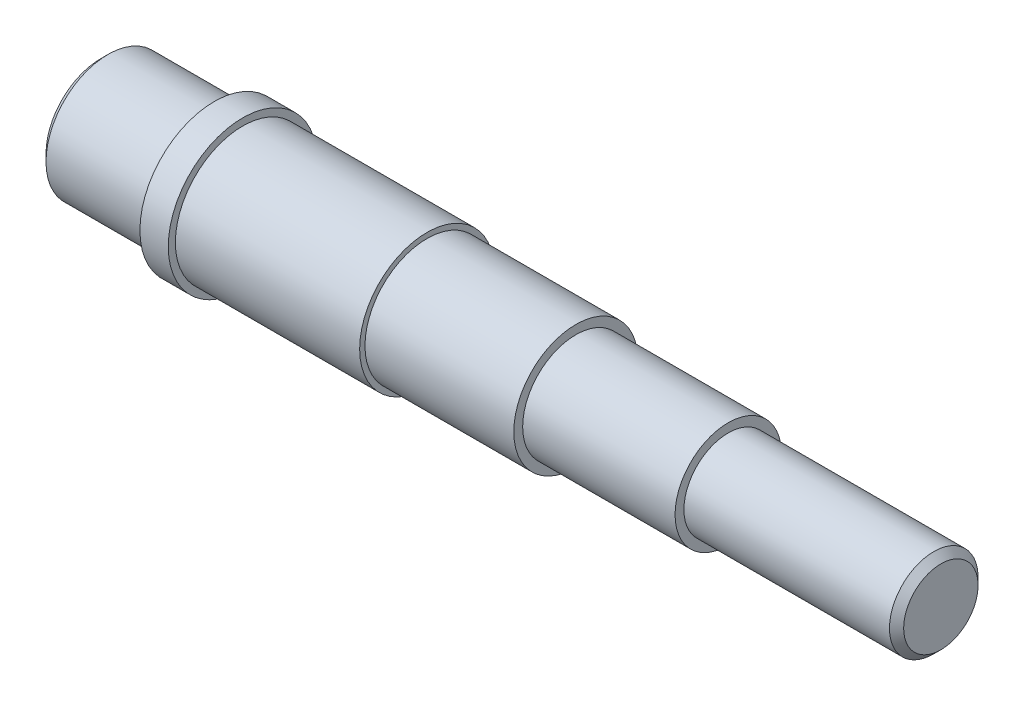
ISO-10303-21;
HEADER;
FILE_DESCRIPTION(('STEP AP214'),'2;1');
FILE_NAME('part.step','',(''),(''),'','','');
FILE_SCHEMA(('AUTOMOTIVE_DESIGN { 1 0 10303 214 1 1 1 1 }'));
ENDSEC;
DATA;
#1=APPLICATION_CONTEXT('core data for automotive mechanical design processes');
#2=APPLICATION_PROTOCOL_DEFINITION('international standard','automotive_design',2000,#1);
#3=PRODUCT_CONTEXT('',#1,'mechanical');
#4=PRODUCT('Part','Part','',(#3));
#5=PRODUCT_RELATED_PRODUCT_CATEGORY('part','',(#4));
#6=PRODUCT_DEFINITION_FORMATION('','',#4);
#7=PRODUCT_DEFINITION_CONTEXT('part definition',#1,'design');
#8=PRODUCT_DEFINITION('design','',#6,#7);
#9=PRODUCT_DEFINITION_SHAPE('','',#8);
#10=(LENGTH_UNIT() NAMED_UNIT(*) SI_UNIT(.MILLI.,.METRE.));
#11=(NAMED_UNIT(*) PLANE_ANGLE_UNIT() SI_UNIT($,.RADIAN.));
#12=(NAMED_UNIT(*) SI_UNIT($,.STERADIAN.) SOLID_ANGLE_UNIT());
#13=UNCERTAINTY_MEASURE_WITH_UNIT(LENGTH_MEASURE(1.E-05),#10,'distance_accuracy_value','');
#14=(GEOMETRIC_REPRESENTATION_CONTEXT(3) GLOBAL_UNCERTAINTY_ASSIGNED_CONTEXT((#13)) GLOBAL_UNIT_ASSIGNED_CONTEXT((#10,
#11,#12)) REPRESENTATION_CONTEXT('',''));
#15=CARTESIAN_POINT('',(0.,0.,0.));
#16=DIRECTION('',(0.,0.,1.));
#17=DIRECTION('',(1.,0.,0.));
#18=AXIS2_PLACEMENT_3D('',#15,#16,#17);
#19=CARTESIAN_POINT('',(-128.123292872515,0.,0.));
#20=DIRECTION('',(1.,0.,0.));
#21=DIRECTION('',(0.,0.,-1.));
#22=AXIS2_PLACEMENT_3D('',#19,#20,#21);
#23=PLANE('',#22);
#24=CARTESIAN_POINT('',(-128.123292872515,0.,0.));
#25=DIRECTION('',(-1.,0.,0.));
#26=DIRECTION('',(0.,0.,1.));
#27=AXIS2_PLACEMENT_3D('',#24,#25,#26);
#28=CIRCLE('',#27,15.5);
#29=CARTESIAN_POINT('',(-128.123292872515,0.,15.5));
#30=VERTEX_POINT('',#29);
#31=EDGE_CURVE('E191',#30,#30,#28,.T.);
#32=ORIENTED_EDGE('',*,*,#31,.T.);
#33=EDGE_LOOP('',(#32));
#34=FACE_BOUND('',#33,.T.);
#35=ADVANCED_FACE('F34',(#34),#23,.F.);
#36=CARTESIAN_POINT('',(-126.123292872515,0.,0.));
#37=DIRECTION('',(1.,0.,0.));
#38=DIRECTION('',(0.,0.,-1.));
#39=AXIS2_PLACEMENT_3D('',#36,#37,#38);
#40=CONICAL_SURFACE('',#39,17.5,0.785398163397448);
#41=ORIENTED_EDGE('',*,*,#31,.F.);
#42=EDGE_LOOP('',(#41));
#43=FACE_BOUND('',#42,.T.);
#44=CARTESIAN_POINT('',(-126.123292872515,0.,0.));
#45=DIRECTION('',(-1.,0.,0.));
#46=DIRECTION('',(0.,0.,1.));
#47=AXIS2_PLACEMENT_3D('',#44,#45,#46);
#48=CIRCLE('',#47,17.5);
#49=CARTESIAN_POINT('',(-126.123292872515,0.,17.5));
#50=VERTEX_POINT('',#49);
#51=EDGE_CURVE('E188',#50,#50,#48,.T.);
#52=ORIENTED_EDGE('',*,*,#51,.T.);
#53=EDGE_LOOP('',(#52));
#54=FACE_BOUND('',#53,.T.);
#55=ADVANCED_FACE('F243',(#43,#54),#40,.T.);
#56=CARTESIAN_POINT('',(-128.123292872515,0.,0.));
#57=DIRECTION('',(-1.,0.,0.));
#58=DIRECTION('',(0.,0.,1.));
#59=AXIS2_PLACEMENT_3D('',#56,#57,#58);
#60=CYLINDRICAL_SURFACE('',#59,17.5);
#61=ORIENTED_EDGE('',*,*,#51,.F.);
#62=EDGE_LOOP('',(#61));
#63=FACE_BOUND('',#62,.T.);
#64=CARTESIAN_POINT('',(-96.1232928725146,0.,0.));
#65=DIRECTION('',(-1.,0.,0.));
#66=DIRECTION('',(0.,0.,1.));
#67=AXIS2_PLACEMENT_3D('',#64,#65,#66);
#68=CIRCLE('',#67,17.5);
#69=CARTESIAN_POINT('',(-96.1232928725146,0.,17.5));
#70=VERTEX_POINT('',#69);
#71=EDGE_CURVE('E185',#70,#70,#68,.T.);
#72=ORIENTED_EDGE('',*,*,#71,.T.);
#73=EDGE_LOOP('',(#72));
#74=FACE_BOUND('',#73,.T.);
#75=ADVANCED_FACE('F248',(#63,#74),#60,.T.);
#76=CARTESIAN_POINT('',(-96.1232928725146,0.,-17.5));
#77=DIRECTION('',(1.,0.,0.));
#78=DIRECTION('',(0.,0.,-1.));
#79=AXIS2_PLACEMENT_3D('',#76,#77,#78);
#80=PLANE('',#79);
#81=ORIENTED_EDGE('',*,*,#71,.F.);
#82=EDGE_LOOP('',(#81));
#83=FACE_BOUND('',#82,.T.);
#84=CARTESIAN_POINT('',(-96.1232928725146,0.,0.));
#85=DIRECTION('',(-1.,0.,0.));
#86=DIRECTION('',(0.,0.,1.));
#87=AXIS2_PLACEMENT_3D('',#84,#85,#86);
#88=CIRCLE('',#87,21.);
#89=CARTESIAN_POINT('',(-96.1232928725146,0.,21.));
#90=VERTEX_POINT('',#89);
#91=EDGE_CURVE('E182',#90,#90,#88,.T.);
#92=ORIENTED_EDGE('',*,*,#91,.T.);
#93=EDGE_LOOP('',(#92));
#94=FACE_BOUND('',#93,.T.);
#95=ADVANCED_FACE('F256',(#83,#94),#80,.F.);
#96=CARTESIAN_POINT('',(-128.123292872515,0.,0.));
#97=DIRECTION('',(-1.,0.,0.));
#98=DIRECTION('',(0.,0.,1.));
#99=AXIS2_PLACEMENT_3D('',#96,#97,#98);
#100=CYLINDRICAL_SURFACE('',#99,21.);
#101=ORIENTED_EDGE('',*,*,#91,.F.);
#102=EDGE_LOOP('',(#101));
#103=FACE_BOUND('',#102,.T.);
#104=CARTESIAN_POINT('',(-88.1232928725146,0.,0.));
#105=DIRECTION('',(-1.,0.,0.));
#106=DIRECTION('',(0.,0.,1.));
#107=AXIS2_PLACEMENT_3D('',#104,#105,#106);
#108=CIRCLE('',#107,21.);
#109=CARTESIAN_POINT('',(-88.1232928725146,0.,21.));
#110=VERTEX_POINT('',#109);
#111=EDGE_CURVE('E179',#110,#110,#108,.T.);
#112=ORIENTED_EDGE('',*,*,#111,.T.);
#113=EDGE_LOOP('',(#112));
#114=FACE_BOUND('',#113,.T.);
#115=ADVANCED_FACE('F262',(#103,#114),#100,.T.);
#116=CARTESIAN_POINT('',(-88.1232928725146,0.,-21.));
#117=DIRECTION('',(-1.,0.,0.));
#118=DIRECTION('',(0.,0.,1.));
#119=AXIS2_PLACEMENT_3D('',#116,#117,#118);
#120=PLANE('',#119);
#121=ORIENTED_EDGE('',*,*,#111,.F.);
#122=EDGE_LOOP('',(#121));
#123=FACE_BOUND('',#122,.T.);
#124=CARTESIAN_POINT('',(-88.1232928725146,0.,0.));
#125=DIRECTION('',(-1.,0.,0.));
#126=DIRECTION('',(0.,0.,1.));
#127=AXIS2_PLACEMENT_3D('',#124,#125,#126);
#128=CIRCLE('',#127,19.);
#129=CARTESIAN_POINT('',(-88.1232928725146,0.,19.));
#130=VERTEX_POINT('',#129);
#131=EDGE_CURVE('E176',#130,#130,#128,.T.);
#132=ORIENTED_EDGE('',*,*,#131,.T.);
#133=EDGE_LOOP('',(#132));
#134=FACE_BOUND('',#133,.T.);
#135=ADVANCED_FACE('F268',(#123,#134),#120,.F.);
#136=CARTESIAN_POINT('',(-128.123292872515,0.,0.));
#137=DIRECTION('',(-1.,0.,0.));
#138=DIRECTION('',(0.,0.,1.));
#139=AXIS2_PLACEMENT_3D('',#136,#137,#138);
#140=CYLINDRICAL_SURFACE('',#139,19.);
#141=DIRECTION('',(-1.,0.,0.));
#142=VECTOR('',#141,1.);
#143=CARTESIAN_POINT('',(-128.123292872515,-5.00000000000001,-18.3303027798234));
#144=LINE('',#143,#142);
#145=CARTESIAN_POINT('',(-79.1232928725146,-5.,-18.3303027798234));
#146=VERTEX_POINT('',#145);
#147=CARTESIAN_POINT('',(-44.1232928725146,-5.,-18.3303027798234));
#148=VERTEX_POINT('',#147);
#149=EDGE_CURVE('E11',#146,#148,#144,.F.);
#150=ORIENTED_EDGE('',*,*,#149,.T.);
#151=CARTESIAN_POINT('',(-44.1232928725146,-5.,-18.3303027798234));
#152=CARTESIAN_POINT('',(-43.9852766753139,-5.00001766668261,-18.3302859082857));
#153=CARTESIAN_POINT('',(-43.8472666764302,-4.99428620669549,-18.3318609913296));
#154=CARTESIAN_POINT('',(-43.5722838189438,-4.97145574831054,-18.3380720236008));
#155=CARTESIAN_POINT('',(-43.4353107762324,-4.95435881807958,-18.3427074159445));
#156=CARTESIAN_POINT('',(-43.1636627714728,-4.90897601752026,-18.3549032155987));
#157=CARTESIAN_POINT('',(-43.0289835671527,-4.88071385252822,-18.3624574251155));
#158=CARTESIAN_POINT('',(-42.7625790742533,-4.8132462031306,-18.3802580223183));
#159=CARTESIAN_POINT('',(-42.6308538351485,-4.77404053558503,-18.3905044550585));
#160=CARTESIAN_POINT('',(-42.3713046512391,-4.68501289335864,-18.4133853968542));
#161=CARTESIAN_POINT('',(-42.243479240553,-4.63519496528776,-18.4260189954416));
#162=CARTESIAN_POINT('',(-41.9925125113837,-4.52532553542389,-18.4533094170246));
#163=CARTESIAN_POINT('',(-41.8693729522717,-4.46527023534238,-18.4679669905744));
#164=CARTESIAN_POINT('',(-41.508228444171,-4.27037749337001,-18.5143659713688));
#165=CARTESIAN_POINT('',(-41.2783055316541,-4.12074697519632,-18.5485515146361));
#166=CARTESIAN_POINT('',(-40.8416034995497,-3.78266195018417,-18.6204696894086));
#167=CARTESIAN_POINT('',(-40.6354396606521,-3.59343075278062,-18.658263492612));
#168=CARTESIAN_POINT('',(-40.2573304275002,-3.18310193538117,-18.732625835079));
#169=CARTESIAN_POINT('',(-40.0853905689688,-2.96199917012089,-18.76919417533));
#170=CARTESIAN_POINT('',(-39.7781134581538,-2.48996924780924,-18.8376675811324));
#171=CARTESIAN_POINT('',(-39.6433875832447,-2.23863143936237,-18.8694912031433));
#172=CARTESIAN_POINT('',(-39.4183393902255,-1.71590637997247,-18.9241806310349));
#173=CARTESIAN_POINT('',(-39.3280076729719,-1.44452338700979,-18.9470483328572));
#174=CARTESIAN_POINT('',(-39.1962957803549,-0.895832897884245,-18.9808144065777));
#175=CARTESIAN_POINT('',(-39.1538677288869,-0.618792947063998,-18.9919686097243));
#176=CARTESIAN_POINT('',(-39.1158719037671,-0.0613112052362413,-19.0019448285789));
#177=CARTESIAN_POINT('',(-39.120297506908,0.219130099359589,-19.0007685873121));
#178=CARTESIAN_POINT('',(-39.1751415050027,0.768151117298731,-18.9864044979906));
#179=CARTESIAN_POINT('',(-39.2244270669913,1.03685296683871,-18.9735125161181));
#180=CARTESIAN_POINT('',(-39.3657726178937,1.562032997849,-18.9375121568335));
#181=CARTESIAN_POINT('',(-39.4578346076658,1.81851060691425,-18.9144033015318));
#182=CARTESIAN_POINT('',(-39.6829640504233,2.3148475496931,-18.8601298911963));
#183=CARTESIAN_POINT('',(-39.816423112912,2.55452016615559,-18.8288888816724));
#184=CARTESIAN_POINT('',(-40.1203895872577,3.00854301144998,-18.7616994100197));
#185=CARTESIAN_POINT('',(-40.2909032872355,3.22288893283458,-18.7257501493189));
#186=CARTESIAN_POINT('',(-40.5736655411899,3.52419659305494,-18.6705907034911));
#187=CARTESIAN_POINT('',(-40.6741116249612,3.62255621938199,-18.6517101060183));
#188=CARTESIAN_POINT('',(-40.882942248198,3.81048914275925,-18.6142238908637));
#189=CARTESIAN_POINT('',(-40.9913239939339,3.90006550620351,-18.5956181791551));
#190=CARTESIAN_POINT('',(-41.2153993863113,4.0698819613128,-18.5591922415691));
#191=CARTESIAN_POINT('',(-41.331097817823,4.15011584380694,-18.5413725429207));
#192=CARTESIAN_POINT('',(-41.5689449540047,4.3005928981472,-18.5070487697456));
#193=CARTESIAN_POINT('',(-41.6910911361465,4.37083993796059,-18.4905441869608));
#194=CARTESIAN_POINT('',(-41.9419150946349,4.50130100976656,-18.4592205654969));
#195=CARTESIAN_POINT('',(-42.0706318161017,4.56144316630361,-18.4444138217068));
#196=CARTESIAN_POINT('',(-42.3328733538445,4.67060599397032,-18.4170737812662));
#197=CARTESIAN_POINT('',(-42.4663962142551,4.71963113120057,-18.4045395720651));
#198=CARTESIAN_POINT('',(-42.7371961708602,4.80613348025077,-18.3821401987773));
#199=CARTESIAN_POINT('',(-42.8744692113669,4.84362266837273,-18.3722722679413));
#200=CARTESIAN_POINT('',(-43.1518289985406,4.90677851660471,-18.3555057309761));
#201=CARTESIAN_POINT('',(-43.2919144004819,4.93245069281332,-18.3486057395322));
#202=CARTESIAN_POINT('',(-43.5472608799676,4.96805016310397,-18.3389956133326));
#203=CARTESIAN_POINT('',(-43.662219297974,4.98003415018343,-18.3357406080542));
#204=CARTESIAN_POINT('',(-43.8925463017877,4.99600639007608,-18.3313920220704));
#205=CARTESIAN_POINT('',(-44.0079139416976,5.00000735763537,-18.3302950043258));
#206=CARTESIAN_POINT('',(-44.1232928725146,5.,-18.3303027798234));
#207=B_SPLINE_CURVE_WITH_KNOTS('',3,(#151,#152,#153,#154,#155,#156,#157,#158,#159,#160,#161,
#162,#163,#164,#165,#166,#167,#168,#169,#170,#171,#172,#173,#174,#175,#176,#177,#178,#179,#180,
#181,#182,#183,#184,#185,#186,#187,#188,#189,#190,#191,#192,#193,#194,#195,#196,#197,#198,#199,
#200,#201,#202,#203,#204,#205,#206),.UNSPECIFIED.,.F.,.F.,(4,2,2,2,2,2,2,2,2,2,2,2,2,2,2,2,2,2,
2,2,2,2,2,2,2,2,2,4),(0.,0.413911055875706,0.827746813248339,1.24070862177835,1.65367734165684,
2.06648887151102,2.47945389814995,3.30477934860257,4.14813364543846,4.99162424403129,
5.84824381544335,6.70468194490246,7.54199904887895,8.37919779174081,9.19582441640862,
10.0124892424595,10.8371281703848,11.6619071478275,12.0870382665453,12.5120204319564,
12.9372834547274,13.3623813190941,13.7903854272744,14.2182172852097,14.6456034696819,
15.0727899504498,15.4193832237595,15.7654240276075),.UNSPECIFIED.);
#208=CARTESIAN_POINT('',(-44.1232928725146,5.,-18.3303027798234));
#209=VERTEX_POINT('',#208);
#210=EDGE_CURVE('E318',#148,#209,#207,.T.);
#211=ORIENTED_EDGE('',*,*,#210,.T.);
#212=DIRECTION('',(-1.,0.,0.));
#213=VECTOR('',#212,1.);
#214=CARTESIAN_POINT('',(-128.123292872515,5.,-18.3303027798234));
#215=LINE('',#214,#213);
#216=CARTESIAN_POINT('',(-79.1232928725146,5.,-18.3303027798234));
#217=VERTEX_POINT('',#216);
#218=EDGE_CURVE('E41',#209,#217,#215,.T.);
#219=ORIENTED_EDGE('',*,*,#218,.T.);
#220=CARTESIAN_POINT('',(-79.1232928725146,5.,-18.3303027798234));
#221=CARTESIAN_POINT('',(-79.2613090697152,5.00001766668261,-18.3302859082857));
#222=CARTESIAN_POINT('',(-79.3993190685989,4.9942862066955,-18.3318609913296));
#223=CARTESIAN_POINT('',(-79.6743019260853,4.97145574831055,-18.3380720236008));
#224=CARTESIAN_POINT('',(-79.8112749687967,4.95435881807958,-18.3427074159445));
#225=CARTESIAN_POINT('',(-80.0829229735564,4.90897601752026,-18.3549032155987));
#226=CARTESIAN_POINT('',(-80.2176021778764,4.88071385252822,-18.3624574251155));
#227=CARTESIAN_POINT('',(-80.4840066707758,4.81324620313061,-18.3802580223183));
#228=CARTESIAN_POINT('',(-80.6157319098806,4.77404053558504,-18.3905044550585));
#229=CARTESIAN_POINT('',(-80.8752810937901,4.68501289335865,-18.4133853968542));
#230=CARTESIAN_POINT('',(-81.0031065044761,4.63519496528777,-18.4260189954416));
#231=CARTESIAN_POINT('',(-81.2540732336454,4.5253255354239,-18.4533094170246));
#232=CARTESIAN_POINT('',(-81.3772127927574,4.46527023534239,-18.4679669905744));
#233=CARTESIAN_POINT('',(-81.7383573008581,4.27037749337003,-18.5143659713688));
#234=CARTESIAN_POINT('',(-81.9682802133751,4.12074697519632,-18.5485515146361));
#235=CARTESIAN_POINT('',(-82.4049822454794,3.78266195018417,-18.6204696894086));
#236=CARTESIAN_POINT('',(-82.611146084377,3.59343075278063,-18.658263492612));
#237=CARTESIAN_POINT('',(-82.9892553175289,3.18310193538118,-18.732625835079));
#238=CARTESIAN_POINT('',(-83.1611951760604,2.9619991701209,-18.76919417533));
#239=CARTESIAN_POINT('',(-83.4684722868753,2.48996924780925,-18.8376675811324));
#240=CARTESIAN_POINT('',(-83.6031981617844,2.23863143936238,-18.8694912031433));
#241=CARTESIAN_POINT('',(-83.8282463548036,1.71590637997248,-18.9241806310349));
#242=CARTESIAN_POINT('',(-83.9185780720572,1.4445233870098,-18.9470483328572));
#243=CARTESIAN_POINT('',(-84.0502899646742,0.89583289788425,-18.9808144065777));
#244=CARTESIAN_POINT('',(-84.0927180161423,0.618792947064002,-18.9919686097243));
#245=CARTESIAN_POINT('',(-84.130713841262,0.0613112052362446,-19.0019448285789));
#246=CARTESIAN_POINT('',(-84.1262882381211,-0.219130099359586,-19.0007685873121));
#247=CARTESIAN_POINT('',(-84.0714442400264,-0.768151117298729,-18.9864044979906));
#248=CARTESIAN_POINT('',(-84.0221586780378,-1.03685296683871,-18.9735125161181));
#249=CARTESIAN_POINT('',(-83.8808131271355,-1.562032997849,-18.9375121568335));
#250=CARTESIAN_POINT('',(-83.7887511373633,-1.81851060691425,-18.9144033015318));
#251=CARTESIAN_POINT('',(-83.5636216946058,-2.3148475496931,-18.8601298911963));
#252=CARTESIAN_POINT('',(-83.4301626321171,-2.55452016615559,-18.8288888816724));
#253=CARTESIAN_POINT('',(-83.1261961577714,-3.00854301144999,-18.7616994100197));
#254=CARTESIAN_POINT('',(-82.9556824577937,-3.22288893283458,-18.7257501493189));
#255=CARTESIAN_POINT('',(-82.6729202038392,-3.52419659305495,-18.6705907034911));
#256=CARTESIAN_POINT('',(-82.5724741200679,-3.62255621938199,-18.6517101060183));
#257=CARTESIAN_POINT('',(-82.3636434968311,-3.81048914275926,-18.6142238908637));
#258=CARTESIAN_POINT('',(-82.2552617510953,-3.90006550620352,-18.5956181791551));
#259=CARTESIAN_POINT('',(-82.0311863587178,-4.06988196131281,-18.5591922415691));
#260=CARTESIAN_POINT('',(-81.9154879272061,-4.15011584380695,-18.5413725429207));
#261=CARTESIAN_POINT('',(-81.6776407910244,-4.30059289814721,-18.5070487697456));
#262=CARTESIAN_POINT('',(-81.5554946088826,-4.3708399379606,-18.4905441869608));
#263=CARTESIAN_POINT('',(-81.3046706503942,-4.50130100976656,-18.4592205654969));
#264=CARTESIAN_POINT('',(-81.1759539289274,-4.56144316630362,-18.4444138217068));
#265=CARTESIAN_POINT('',(-80.9137123911846,-4.67060599397033,-18.4170737812662));
#266=CARTESIAN_POINT('',(-80.780189530774,-4.71963113120059,-18.4045395720651));
#267=CARTESIAN_POINT('',(-80.5093895741689,-4.80613348025078,-18.3821401987773));
#268=CARTESIAN_POINT('',(-80.3721165336623,-4.84362266837274,-18.3722722679413));
#269=CARTESIAN_POINT('',(-80.0947567464885,-4.90677851660471,-18.3555057309761));
#270=CARTESIAN_POINT('',(-79.9546713445472,-4.93245069281332,-18.3486057395322));
#271=CARTESIAN_POINT('',(-79.6993248650616,-4.96805016310397,-18.3389956133326));
#272=CARTESIAN_POINT('',(-79.5843664470551,-4.98003415018343,-18.3357406080542));
#273=CARTESIAN_POINT('',(-79.3540394432414,-4.99600639007608,-18.3313920220704));
#274=CARTESIAN_POINT('',(-79.2386718033316,-5.00000735763538,-18.3302950043258));
#275=CARTESIAN_POINT('',(-79.1232928725146,-5.,-18.3303027798234));
#276=B_SPLINE_CURVE_WITH_KNOTS('',3,(#220,#221,#222,#223,#224,#225,#226,#227,#228,#229,#230,
#231,#232,#233,#234,#235,#236,#237,#238,#239,#240,#241,#242,#243,#244,#245,#246,#247,#248,#249,
#250,#251,#252,#253,#254,#255,#256,#257,#258,#259,#260,#261,#262,#263,#264,#265,#266,#267,#268,
#269,#270,#271,#272,#273,#274,#275),.UNSPECIFIED.,.F.,.F.,(4,2,2,2,2,2,2,2,2,2,2,2,2,2,2,2,2,2,
2,2,2,2,2,2,2,2,2,4),(0.,0.413911055875692,0.827746813248346,1.24070862177833,1.65367734165684,
2.06648887151102,2.47945389814993,3.30477934860257,4.14813364543846,4.99162424403128,
5.84824381544335,6.70468194490246,7.54199904887896,8.37919779174081,9.19582441640863,
10.0124892424595,10.8371281703848,11.6619071478275,12.0870382665453,12.5120204319564,
12.9372834547274,13.3623813190941,13.7903854272744,14.2182172852097,14.6456034696819,
15.0727899504498,15.4193832237595,15.7654240276075),.UNSPECIFIED.);
#277=EDGE_CURVE('E48',#217,#146,#276,.T.);
#278=ORIENTED_EDGE('',*,*,#277,.T.);
#279=EDGE_LOOP('',(#150,#211,#219,#278));
#280=FACE_BOUND('',#279,.T.);
#281=ORIENTED_EDGE('',*,*,#131,.F.);
#282=EDGE_LOOP('',(#281));
#283=FACE_BOUND('',#282,.T.);
#284=CARTESIAN_POINT('',(-36.1232928725146,0.,0.));
#285=DIRECTION('',(-1.,0.,0.));
#286=DIRECTION('',(0.,0.,1.));
#287=AXIS2_PLACEMENT_3D('',#284,#285,#286);
#288=CIRCLE('',#287,19.);
#289=CARTESIAN_POINT('',(-36.1232928725146,0.,19.));
#290=VERTEX_POINT('',#289);
#291=EDGE_CURVE('E173',#290,#290,#288,.T.);
#292=ORIENTED_EDGE('',*,*,#291,.T.);
#293=EDGE_LOOP('',(#292));
#294=FACE_BOUND('',#293,.T.);
#295=ADVANCED_FACE('F274',(#280,#283,#294),#140,.T.);
#296=CARTESIAN_POINT('',(-36.1232928725146,0.,-19.));
#297=DIRECTION('',(-1.,0.,0.));
#298=DIRECTION('',(0.,0.,1.));
#299=AXIS2_PLACEMENT_3D('',#296,#297,#298);
#300=PLANE('',#299);
#301=ORIENTED_EDGE('',*,*,#291,.F.);
#302=EDGE_LOOP('',(#301));
#303=FACE_BOUND('',#302,.T.);
#304=CARTESIAN_POINT('',(-36.1232928725146,0.,0.));
#305=DIRECTION('',(-1.,0.,0.));
#306=DIRECTION('',(0.,0.,1.));
#307=AXIS2_PLACEMENT_3D('',#304,#305,#306);
#308=CIRCLE('',#307,17.5);
#309=CARTESIAN_POINT('',(-36.1232928725146,0.,17.5));
#310=VERTEX_POINT('',#309);
#311=EDGE_CURVE('E170',#310,#310,#308,.T.);
#312=ORIENTED_EDGE('',*,*,#311,.T.);
#313=EDGE_LOOP('',(#312));
#314=FACE_BOUND('',#313,.T.);
#315=ADVANCED_FACE('F280',(#303,#314),#300,.F.);
#316=CARTESIAN_POINT('',(-128.123292872515,0.,0.));
#317=DIRECTION('',(-1.,0.,0.));
#318=DIRECTION('',(0.,0.,1.));
#319=AXIS2_PLACEMENT_3D('',#316,#317,#318);
#320=CYLINDRICAL_SURFACE('',#319,17.5);
#321=ORIENTED_EDGE('',*,*,#311,.F.);
#322=EDGE_LOOP('',(#321));
#323=FACE_BOUND('',#322,.T.);
#324=CARTESIAN_POINT('',(5.87670712748545,0.,0.));
#325=DIRECTION('',(-1.,0.,0.));
#326=DIRECTION('',(0.,0.,1.));
#327=AXIS2_PLACEMENT_3D('',#324,#325,#326);
#328=CIRCLE('',#327,17.5);
#329=CARTESIAN_POINT('',(5.87670712748545,0.,17.5));
#330=VERTEX_POINT('',#329);
#331=EDGE_CURVE('E167',#330,#330,#328,.T.);
#332=ORIENTED_EDGE('',*,*,#331,.T.);
#333=EDGE_LOOP('',(#332));
#334=FACE_BOUND('',#333,.T.);
#335=ADVANCED_FACE('F287',(#323,#334),#320,.T.);
#336=CARTESIAN_POINT('',(5.87670712748545,0.,-17.5));
#337=DIRECTION('',(-1.,0.,0.));
#338=DIRECTION('',(0.,0.,1.));
#339=AXIS2_PLACEMENT_3D('',#336,#337,#338);
#340=PLANE('',#339);
#341=ORIENTED_EDGE('',*,*,#331,.F.);
#342=EDGE_LOOP('',(#341));
#343=FACE_BOUND('',#342,.T.);
#344=CARTESIAN_POINT('',(5.87670712748545,0.,0.));
#345=DIRECTION('',(-1.,0.,0.));
#346=DIRECTION('',(0.,0.,1.));
#347=AXIS2_PLACEMENT_3D('',#344,#345,#346);
#348=CIRCLE('',#347,15.);
#349=CARTESIAN_POINT('',(5.87670712748545,0.,15.));
#350=VERTEX_POINT('',#349);
#351=EDGE_CURVE('E164',#350,#350,#348,.T.);
#352=ORIENTED_EDGE('',*,*,#351,.T.);
#353=EDGE_LOOP('',(#352));
#354=FACE_BOUND('',#353,.T.);
#355=ADVANCED_FACE('F293',(#343,#354),#340,.F.);
#356=CARTESIAN_POINT('',(-128.123292872515,0.,0.));
#357=DIRECTION('',(-1.,0.,0.));
#358=DIRECTION('',(0.,0.,1.));
#359=AXIS2_PLACEMENT_3D('',#356,#357,#358);
#360=CYLINDRICAL_SURFACE('',#359,15.);
#361=ORIENTED_EDGE('',*,*,#351,.F.);
#362=EDGE_LOOP('',(#361));
#363=FACE_BOUND('',#362,.T.);
#364=CARTESIAN_POINT('',(48.8767071274854,0.,0.));
#365=DIRECTION('',(-1.,0.,0.));
#366=DIRECTION('',(0.,0.,1.));
#367=AXIS2_PLACEMENT_3D('',#364,#365,#366);
#368=CIRCLE('',#367,15.);
#369=CARTESIAN_POINT('',(48.8767071274854,0.,15.));
#370=VERTEX_POINT('',#369);
#371=EDGE_CURVE('E161',#370,#370,#368,.T.);
#372=ORIENTED_EDGE('',*,*,#371,.T.);
#373=EDGE_LOOP('',(#372));
#374=FACE_BOUND('',#373,.T.);
#375=ADVANCED_FACE('F299',(#363,#374),#360,.T.);
#376=CARTESIAN_POINT('',(48.8767071274854,0.,-15.));
#377=DIRECTION('',(-1.,0.,0.));
#378=DIRECTION('',(0.,0.,1.));
#379=AXIS2_PLACEMENT_3D('',#376,#377,#378);
#380=PLANE('',#379);
#381=ORIENTED_EDGE('',*,*,#371,.F.);
#382=EDGE_LOOP('',(#381));
#383=FACE_BOUND('',#382,.T.);
#384=CARTESIAN_POINT('',(48.8767071274854,0.,0.));
#385=DIRECTION('',(-1.,0.,0.));
#386=DIRECTION('',(0.,0.,1.));
#387=AXIS2_PLACEMENT_3D('',#384,#385,#386);
#388=CIRCLE('',#387,12.5);
#389=CARTESIAN_POINT('',(48.8767071274854,0.,12.5));
#390=VERTEX_POINT('',#389);
#391=EDGE_CURVE('E158',#390,#390,#388,.T.);
#392=ORIENTED_EDGE('',*,*,#391,.T.);
#393=EDGE_LOOP('',(#392));
#394=FACE_BOUND('',#393,.T.);
#395=ADVANCED_FACE('F238',(#383,#394),#380,.F.);
#396=CARTESIAN_POINT('',(-128.123292872515,0.,0.));
#397=DIRECTION('',(-1.,0.,0.));
#398=DIRECTION('',(0.,0.,1.));
#399=AXIS2_PLACEMENT_3D('',#396,#397,#398);
#400=CYLINDRICAL_SURFACE('',#399,12.5);
#401=DIRECTION('',(-1.,0.,0.));
#402=VECTOR('',#401,1.);
#403=CARTESIAN_POINT('',(-128.123292872515,-3.99999999999997,-11.842719282327));
#404=LINE('',#403,#402);
#405=CARTESIAN_POINT('',(53.8767071274854,-4.,-11.842719282327));
#406=VERTEX_POINT('',#405);
#407=CARTESIAN_POINT('',(101.876707127485,-4.,-11.842719282327));
#408=VERTEX_POINT('',#407);
#409=EDGE_CURVE('E347',#406,#408,#404,.F.);
#410=ORIENTED_EDGE('',*,*,#409,.T.);
#411=CARTESIAN_POINT('',(101.876707127485,-4.,-11.842719282327));
#412=CARTESIAN_POINT('',(101.986106899447,-4.00001410484614,-11.8427027366058));
#413=CARTESIAN_POINT('',(102.095497337333,-3.995512175201,-11.8442348052368));
#414=CARTESIAN_POINT('',(102.313435368222,-3.9775860667845,-11.8502730910574));
#415=CARTESIAN_POINT('',(102.42198316597,-3.96416412872571,-11.8547785613244));
#416=CARTESIAN_POINT('',(102.637168158331,-3.9285572511943,-11.8666242076309));
#417=CARTESIAN_POINT('',(102.743809823097,-3.90639676021451,-11.8739564736691));
#418=CARTESIAN_POINT('',(102.954712765857,-3.85353581488657,-11.8912164993788));
#419=CARTESIAN_POINT('',(103.058973967642,-3.82283508754057,-11.90114434202));
#420=CARTESIAN_POINT('',(103.367012131764,-3.71831764495513,-11.9343840843196));
#421=CARTESIAN_POINT('',(103.566343679553,-3.63203544139888,-11.9611699822066));
#422=CARTESIAN_POINT('',(103.947719684527,-3.42895021192289,-12.0209583955878));
#423=CARTESIAN_POINT('',(104.129754506535,-3.3121303092491,-12.0539643457894));
#424=CARTESIAN_POINT('',(104.477961116085,-3.04678507884791,-12.123798407807));
#425=CARTESIAN_POINT('',(104.643425451825,-2.89735303896515,-12.1607158548651));
#426=CARTESIAN_POINT('',(104.947421976074,-2.57296449846116,-12.2334561140966));
#427=CARTESIAN_POINT('',(105.085949475843,-2.39800356343233,-12.2692787347869));
#428=CARTESIAN_POINT('',(105.335322325856,-2.02237003010512,-12.3368244653945));
#429=CARTESIAN_POINT('',(105.445429083955,-1.82118394546976,-12.3684294972003));
#430=CARTESIAN_POINT('',(105.629956622835,-1.40197197350368,-12.4229251649937));
#431=CARTESIAN_POINT('',(105.704387601267,-1.18395091903581,-12.4458182908278));
#432=CARTESIAN_POINT('',(105.813065991736,-0.744713961063366,-12.4796767811416));
#433=CARTESIAN_POINT('',(105.848532060866,-0.523827920101157,-12.4910030499338));
#434=CARTESIAN_POINT('',(105.882139926527,-0.0789648151746411,-12.5017287122873));
#435=CARTESIAN_POINT('',(105.88028986101,0.145011564197637,-12.5011307063103));
#436=CARTESIAN_POINT('',(105.840108298214,0.581094974437687,-12.4883236673358));
#437=CARTESIAN_POINT('',(105.803099359507,0.793338226675233,-12.4765355800409));
#438=CARTESIAN_POINT('',(105.695826575879,1.2084232001272,-12.443194578958));
#439=CARTESIAN_POINT('',(105.625560920053,1.41126440871778,-12.4216411334261));
#440=CARTESIAN_POINT('',(105.45294928525,1.80478548808183,-12.3706364987475));
#441=CARTESIAN_POINT('',(105.350210607617,1.99528012693527,-12.3410893067347));
#442=CARTESIAN_POINT('',(105.11587807844,2.35673113106229,-12.2771965403044));
#443=CARTESIAN_POINT('',(104.984276921082,2.5276825327575,-12.2428497517893));
#444=CARTESIAN_POINT('',(104.689260596194,2.85304511528221,-12.1712409097156));
#445=CARTESIAN_POINT('',(104.524710424893,3.00641313381737,-12.1339170352569));
#446=CARTESIAN_POINT('',(104.1717352274,3.28377291775701,-12.0618172896256));
#447=CARTESIAN_POINT('',(103.983302868653,3.40775562728565,-12.0270422062066));
#448=CARTESIAN_POINT('',(103.685335889737,3.56958208232606,-11.9796198433082));
#449=CARTESIAN_POINT('',(103.582708068244,3.61975674493764,-11.9645161845072));
#450=CARTESIAN_POINT('',(103.373302374734,3.71123075156255,-11.9364591580623));
#451=CARTESIAN_POINT('',(103.266526239699,3.75253376401034,-11.9235049021446));
#452=CARTESIAN_POINT('',(103.049693799594,3.82585831579179,-11.9001802342949));
#453=CARTESIAN_POINT('',(102.939641149512,3.85788979915529,-11.889807055759));
#454=CARTESIAN_POINT('',(102.717011970538,3.91241790563964,-11.8719756673203));
#455=CARTESIAN_POINT('',(102.604436623688,3.93491889994976,-11.8645161211931));
#456=CARTESIAN_POINT('',(102.389467881624,3.96832908530804,-11.8533815888388));
#457=CARTESIAN_POINT('',(102.287239711691,3.9802038456482,-11.8493925948395));
#458=CARTESIAN_POINT('',(102.082246049452,3.99603937127681,-11.8440568016292));
#459=CARTESIAN_POINT('',(101.979481489205,4.00001099551564,-11.8427063770563));
#460=CARTESIAN_POINT('',(101.876707127485,4.,-11.842719282327));
#461=B_SPLINE_CURVE_WITH_KNOTS('',3,(#411,#412,#413,#414,#415,#416,#417,#418,#419,#420,#421,
#422,#423,#424,#425,#426,#427,#428,#429,#430,#431,#432,#433,#434,#435,#436,#437,#438,#439,#440,
#441,#442,#443,#444,#445,#446,#447,#448,#449,#450,#451,#452,#453,#454,#455,#456,#457,#458,#459,
#460),.UNSPECIFIED.,.F.,.F.,(4,2,2,2,2,2,2,2,2,2,2,2,2,2,2,2,2,2,2,2,2,2,2,2,4),(0.,
0.328080176984097,0.656077971124936,0.983164539368213,1.31026156448799,1.96355293984249,
2.61720612481382,3.29209427898755,3.96709980211698,4.65819584662374,5.34909422856994,
6.01770820975086,6.68617638029994,7.33045501553831,7.97476873730065,8.62719320105812,
9.27978300073407,9.96076419384898,10.6419549776068,10.9872862883783,11.3324745283028,
11.6772911585126,12.0219494657669,12.3305938648259,12.6388138912331),.UNSPECIFIED.);
#462=CARTESIAN_POINT('',(101.876707127485,4.,-11.842719282327));
#463=VERTEX_POINT('',#462);
#464=EDGE_CURVE('E194',#408,#463,#461,.T.);
#465=ORIENTED_EDGE('',*,*,#464,.T.);
#466=DIRECTION('',(-1.,0.,0.));
#467=VECTOR('',#466,1.);
#468=CARTESIAN_POINT('',(-128.123292872515,3.99999999999999,-11.842719282327));
#469=LINE('',#468,#467);
#470=CARTESIAN_POINT('',(53.8767071274854,3.99999999999999,-11.842719282327));
#471=VERTEX_POINT('',#470);
#472=EDGE_CURVE('E344',#463,#471,#469,.T.);
#473=ORIENTED_EDGE('',*,*,#472,.T.);
#474=CARTESIAN_POINT('',(53.8767071274854,4.,-11.842719282327));
#475=CARTESIAN_POINT('',(53.7673073555238,4.00001410484613,-11.8427027366058));
#476=CARTESIAN_POINT('',(53.6579169176375,3.995512175201,-11.8442348052368));
#477=CARTESIAN_POINT('',(53.4399788867489,3.97758606678449,-11.8502730910574));
#478=CARTESIAN_POINT('',(53.3314310890009,3.96416412872571,-11.8547785613244));
#479=CARTESIAN_POINT('',(53.1162460966399,3.92855725119429,-11.8666242076309));
#480=CARTESIAN_POINT('',(53.0096044318742,3.9063967602145,-11.8739564736691));
#481=CARTESIAN_POINT('',(52.7987014891138,3.85353581488657,-11.8912164993788));
#482=CARTESIAN_POINT('',(52.6944402873286,3.82283508754056,-11.90114434202));
#483=CARTESIAN_POINT('',(52.386402123207,3.71831764495512,-11.9343840843196));
#484=CARTESIAN_POINT('',(52.1870705754174,3.63203544139887,-11.9611699822066));
#485=CARTESIAN_POINT('',(51.8056945704436,3.42895021192288,-12.0209583955878));
#486=CARTESIAN_POINT('',(51.6236597484357,3.31213030924909,-12.0539643457894));
#487=CARTESIAN_POINT('',(51.2754531388862,3.0467850788479,-12.123798407807));
#488=CARTESIAN_POINT('',(51.1099888031459,2.89735303896515,-12.1607158548651));
#489=CARTESIAN_POINT('',(50.8059922788965,2.57296449846117,-12.2334561140966));
#490=CARTESIAN_POINT('',(50.6674647791277,2.39800356343233,-12.2692787347869));
#491=CARTESIAN_POINT('',(50.4180919291149,2.02237003010512,-12.3368244653945));
#492=CARTESIAN_POINT('',(50.3079851710158,1.82118394546976,-12.3684294972003));
#493=CARTESIAN_POINT('',(50.123457632136,1.40197197350369,-12.4229251649937));
#494=CARTESIAN_POINT('',(50.0490266537035,1.18395091903581,-12.4458182908278));
#495=CARTESIAN_POINT('',(49.9403482632349,0.74471396106337,-12.4796767811416));
#496=CARTESIAN_POINT('',(49.9048821941053,0.523827920101161,-12.4910030499338));
#497=CARTESIAN_POINT('',(49.8712743284438,0.0789648151746439,-12.5017287122873));
#498=CARTESIAN_POINT('',(49.8731243939606,-0.145011564197635,-12.5011307063103));
#499=CARTESIAN_POINT('',(49.9133059567567,-0.581094974437685,-12.4883236673358));
#500=CARTESIAN_POINT('',(49.9503148954642,-0.793338226675232,-12.4765355800409));
#501=CARTESIAN_POINT('',(50.0575876790917,-1.2084232001272,-12.443194578958));
#502=CARTESIAN_POINT('',(50.1278533349182,-1.41126440871777,-12.4216411334261));
#503=CARTESIAN_POINT('',(50.3004649697212,-1.80478548808182,-12.3706364987475));
#504=CARTESIAN_POINT('',(50.4032036473542,-1.99528012693526,-12.3410893067347));
#505=CARTESIAN_POINT('',(50.6375361765306,-2.35673113106228,-12.2771965403044));
#506=CARTESIAN_POINT('',(50.7691373338884,-2.5276825327575,-12.2428497517893));
#507=CARTESIAN_POINT('',(51.0641536587769,-2.8530451152822,-12.1712409097156));
#508=CARTESIAN_POINT('',(51.2287038300775,-3.00641313381736,-12.1339170352569));
#509=CARTESIAN_POINT('',(51.5816790275707,-3.283772917757,-12.0618172896256));
#510=CARTESIAN_POINT('',(51.7701113863175,-3.40775562728565,-12.0270422062066));
#511=CARTESIAN_POINT('',(52.068078365234,-3.56958208232606,-11.9796198433082));
#512=CARTESIAN_POINT('',(52.1707061867269,-3.61975674493764,-11.9645161845072));
#513=CARTESIAN_POINT('',(52.3801118802371,-3.71123075156255,-11.9364591580623));
#514=CARTESIAN_POINT('',(52.4868880152718,-3.75253376401033,-11.9235049021446));
#515=CARTESIAN_POINT('',(52.703720455377,-3.82585831579178,-11.9001802342949));
#516=CARTESIAN_POINT('',(52.8137731054585,-3.85788979915528,-11.889807055759));
#517=CARTESIAN_POINT('',(53.036402284433,-3.91241790563963,-11.8719756673203));
#518=CARTESIAN_POINT('',(53.1489776312828,-3.93491889994975,-11.8645161211931));
#519=CARTESIAN_POINT('',(53.3639463733464,-3.96832908530803,-11.8533815888388));
#520=CARTESIAN_POINT('',(53.46617454328,-3.9802038456482,-11.8493925948395));
#521=CARTESIAN_POINT('',(53.6711682055187,-3.99603937127681,-11.8440568016292));
#522=CARTESIAN_POINT('',(53.7739327657659,-4.00001099551563,-11.8427063770563));
#523=CARTESIAN_POINT('',(53.8767071274854,-4.,-11.842719282327));
#524=B_SPLINE_CURVE_WITH_KNOTS('',3,(#474,#475,#476,#477,#478,#479,#480,#481,#482,#483,#484,
#485,#486,#487,#488,#489,#490,#491,#492,#493,#494,#495,#496,#497,#498,#499,#500,#501,#502,#503,
#504,#505,#506,#507,#508,#509,#510,#511,#512,#513,#514,#515,#516,#517,#518,#519,#520,#521,#522,
#523),.UNSPECIFIED.,.F.,.F.,(4,2,2,2,2,2,2,2,2,2,2,2,2,2,2,2,2,2,2,2,2,2,2,2,4),(0.,
0.328080176984104,0.656077971124942,0.983164539368206,1.31026156448799,1.96355293984247,
2.61720612481382,3.29209427898755,3.96709980211696,4.65819584662373,5.34909422856992,
6.01770820975085,6.68617638029993,7.33045501553829,7.97476873730064,8.62719320105809,
9.27978300073406,9.96076419384896,10.6419549776068,10.9872862883783,11.3324745283028,
11.6772911585126,12.0219494657669,12.3305938648259,12.6388138912331),.UNSPECIFIED.);
#525=EDGE_CURVE('E56',#471,#406,#524,.T.);
#526=ORIENTED_EDGE('',*,*,#525,.T.);
#527=EDGE_LOOP('',(#410,#465,#473,#526));
#528=FACE_BOUND('',#527,.T.);
#529=ORIENTED_EDGE('',*,*,#391,.F.);
#530=EDGE_LOOP('',(#529));
#531=FACE_BOUND('',#530,.T.);
#532=CARTESIAN_POINT('',(106.876707127485,0.,0.));
#533=DIRECTION('',(-1.,0.,0.));
#534=DIRECTION('',(0.,0.,1.));
#535=AXIS2_PLACEMENT_3D('',#532,#533,#534);
#536=CIRCLE('',#535,12.5);
#537=CARTESIAN_POINT('',(106.876707127485,0.,12.5));
#538=VERTEX_POINT('',#537);
#539=EDGE_CURVE('E155',#538,#538,#536,.T.);
#540=ORIENTED_EDGE('',*,*,#539,.T.);
#541=EDGE_LOOP('',(#540));
#542=FACE_BOUND('',#541,.T.);
#543=ADVANCED_FACE('F209',(#528,#531,#542),#400,.T.);
#544=CARTESIAN_POINT('',(108.876707127485,0.,0.));
#545=DIRECTION('',(-1.,0.,0.));
#546=DIRECTION('',(0.,0.,1.));
#547=AXIS2_PLACEMENT_3D('',#544,#545,#546);
#548=CONICAL_SURFACE('',#547,10.5,0.785398163397448);
#549=ORIENTED_EDGE('',*,*,#539,.F.);
#550=EDGE_LOOP('',(#549));
#551=FACE_BOUND('',#550,.T.);
#552=CARTESIAN_POINT('',(108.876707127485,0.,0.));
#553=DIRECTION('',(-1.,0.,0.));
#554=DIRECTION('',(0.,0.,1.));
#555=AXIS2_PLACEMENT_3D('',#552,#553,#554);
#556=CIRCLE('',#555,10.5);
#557=CARTESIAN_POINT('',(108.876707127485,0.,10.5));
#558=VERTEX_POINT('',#557);
#559=EDGE_CURVE('E145',#558,#558,#556,.T.);
#560=ORIENTED_EDGE('',*,*,#559,.T.);
#561=EDGE_LOOP('',(#560));
#562=FACE_BOUND('',#561,.T.);
#563=ADVANCED_FACE('F231',(#551,#562),#548,.T.);
#564=CARTESIAN_POINT('',(108.876707127485,0.,-10.5));
#565=DIRECTION('',(-1.,0.,0.));
#566=DIRECTION('',(0.,0.,1.));
#567=AXIS2_PLACEMENT_3D('',#564,#565,#566);
#568=PLANE('',#567);
#569=ORIENTED_EDGE('',*,*,#559,.F.);
#570=EDGE_LOOP('',(#569));
#571=FACE_BOUND('',#570,.T.);
#572=ADVANCED_FACE('F229',(#571),#568,.F.);
#573=CARTESIAN_POINT('',(53.8767071274854,0.,-8.5));
#574=DIRECTION('',(0.,0.,-1.));
#575=DIRECTION('',(-1.,0.,0.));
#576=AXIS2_PLACEMENT_3D('',#573,#574,#575);
#577=CYLINDRICAL_SURFACE('',#576,4.);
#578=DIRECTION('',(0.,0.,-1.));
#579=VECTOR('',#578,1.);
#580=CARTESIAN_POINT('',(53.8767071274854,4.,-8.5));
#581=LINE('',#580,#579);
#582=CARTESIAN_POINT('',(53.8767071274854,4.,-8.5));
#583=VERTEX_POINT('',#582);
#584=EDGE_CURVE('E142',#583,#471,#581,.T.);
#585=ORIENTED_EDGE('',*,*,#584,.F.);
#586=CARTESIAN_POINT('',(53.8767071274854,0.,-8.5));
#587=DIRECTION('',(0.,0.,-1.));
#588=DIRECTION('',(-1.,0.,0.));
#589=AXIS2_PLACEMENT_3D('',#586,#587,#588);
#590=CIRCLE('',#589,4.);
#591=CARTESIAN_POINT('',(53.8767071274854,-4.,-8.5));
#592=VERTEX_POINT('',#591);
#593=EDGE_CURVE('E126',#592,#583,#590,.T.);
#594=ORIENTED_EDGE('',*,*,#593,.F.);
#595=DIRECTION('',(0.,0.,-1.));
#596=VECTOR('',#595,1.);
#597=CARTESIAN_POINT('',(53.8767071274854,-4.,-8.5));
#598=LINE('',#597,#596);
#599=EDGE_CURVE('E143',#592,#406,#598,.T.);
#600=ORIENTED_EDGE('',*,*,#599,.T.);
#601=ORIENTED_EDGE('',*,*,#525,.F.);
#602=EDGE_LOOP('',(#585,#594,#600,#601));
#603=FACE_BOUND('',#602,.T.);
#604=ADVANCED_FACE('F225',(#603),#577,.F.);
#605=CARTESIAN_POINT('',(101.876707127485,-4.00000000000001,-8.5));
#606=DIRECTION('',(0.,-1.,0.));
#607=DIRECTION('',(1.,0.,0.));
#608=AXIS2_PLACEMENT_3D('',#605,#606,#607);
#609=PLANE('',#608);
#610=ORIENTED_EDGE('',*,*,#599,.F.);
#611=DIRECTION('',(-1.,0.,0.));
#612=VECTOR('',#611,1.);
#613=CARTESIAN_POINT('',(101.876707127485,-4.00000000000001,-8.5));
#614=LINE('',#613,#612);
#615=CARTESIAN_POINT('',(101.876707127485,-4.,-8.5));
#616=VERTEX_POINT('',#615);
#617=EDGE_CURVE('E139',#616,#592,#614,.T.);
#618=ORIENTED_EDGE('',*,*,#617,.F.);
#619=DIRECTION('',(0.,0.,-1.));
#620=VECTOR('',#619,1.);
#621=CARTESIAN_POINT('',(101.876707127485,-4.,-8.5));
#622=LINE('',#621,#620);
#623=EDGE_CURVE('E146',#616,#408,#622,.T.);
#624=ORIENTED_EDGE('',*,*,#623,.T.);
#625=ORIENTED_EDGE('',*,*,#409,.F.);
#626=EDGE_LOOP('',(#610,#618,#624,#625));
#627=FACE_BOUND('',#626,.T.);
#628=ADVANCED_FACE('F219',(#627),#609,.F.);
#629=CARTESIAN_POINT('',(101.876707127485,0.,-8.5));
#630=DIRECTION('',(0.,0.,-1.));
#631=DIRECTION('',(-1.,0.,0.));
#632=AXIS2_PLACEMENT_3D('',#629,#630,#631);
#633=CYLINDRICAL_SURFACE('',#632,4.);
#634=ORIENTED_EDGE('',*,*,#623,.F.);
#635=CARTESIAN_POINT('',(101.876707127485,0.,-8.5));
#636=DIRECTION('',(0.,0.,-1.));
#637=DIRECTION('',(-1.,0.,0.));
#638=AXIS2_PLACEMENT_3D('',#635,#636,#637);
#639=CIRCLE('',#638,4.);
#640=CARTESIAN_POINT('',(101.876707127485,4.,-8.5));
#641=VERTEX_POINT('',#640);
#642=EDGE_CURVE('E136',#641,#616,#639,.T.);
#643=ORIENTED_EDGE('',*,*,#642,.F.);
#644=DIRECTION('',(0.,0.,-1.));
#645=VECTOR('',#644,1.);
#646=CARTESIAN_POINT('',(101.876707127485,4.,-8.5));
#647=LINE('',#646,#645);
#648=EDGE_CURVE('E149',#641,#463,#647,.T.);
#649=ORIENTED_EDGE('',*,*,#648,.T.);
#650=ORIENTED_EDGE('',*,*,#464,.F.);
#651=EDGE_LOOP('',(#634,#643,#649,#650));
#652=FACE_BOUND('',#651,.T.);
#653=ADVANCED_FACE('F213',(#652),#633,.F.);
#654=CARTESIAN_POINT('',(101.876707127485,4.,-8.5));
#655=DIRECTION('',(0.,1.,0.));
#656=DIRECTION('',(-1.,0.,0.));
#657=AXIS2_PLACEMENT_3D('',#654,#655,#656);
#658=PLANE('',#657);
#659=ORIENTED_EDGE('',*,*,#648,.F.);
#660=DIRECTION('',(1.,0.,0.));
#661=VECTOR('',#660,1.);
#662=CARTESIAN_POINT('',(101.876707127485,4.,-8.5));
#663=LINE('',#662,#661);
#664=EDGE_CURVE('E133',#583,#641,#663,.T.);
#665=ORIENTED_EDGE('',*,*,#664,.F.);
#666=ORIENTED_EDGE('',*,*,#584,.T.);
#667=ORIENTED_EDGE('',*,*,#472,.F.);
#668=EDGE_LOOP('',(#659,#665,#666,#667));
#669=FACE_BOUND('',#668,.T.);
#670=ADVANCED_FACE('F218',(#669),#658,.F.);
#671=CARTESIAN_POINT('',(53.8767071274854,0.,-8.5));
#672=DIRECTION('',(0.,0.,-1.));
#673=DIRECTION('',(-1.,0.,0.));
#674=AXIS2_PLACEMENT_3D('',#671,#672,#673);
#675=PLANE('',#674);
#676=ORIENTED_EDGE('',*,*,#593,.T.);
#677=ORIENTED_EDGE('',*,*,#664,.T.);
#678=ORIENTED_EDGE('',*,*,#642,.T.);
#679=ORIENTED_EDGE('',*,*,#617,.T.);
#680=EDGE_LOOP('',(#676,#677,#678,#679));
#681=FACE_BOUND('',#680,.T.);
#682=ADVANCED_FACE('F223',(#681),#675,.T.);
#683=CARTESIAN_POINT('',(-79.1232928725146,0.,-14.));
#684=DIRECTION('',(0.,0.,-1.));
#685=DIRECTION('',(-1.,0.,0.));
#686=AXIS2_PLACEMENT_3D('',#683,#684,#685);
#687=CYLINDRICAL_SURFACE('',#686,5.);
#688=DIRECTION('',(0.,0.,-1.));
#689=VECTOR('',#688,1.);
#690=CARTESIAN_POINT('',(-79.1232928725146,5.,-14.));
#691=LINE('',#690,#689);
#692=CARTESIAN_POINT('',(-79.1232928725146,5.,-14.));
#693=VERTEX_POINT('',#692);
#694=EDGE_CURVE('E98',#693,#217,#691,.T.);
#695=ORIENTED_EDGE('',*,*,#694,.F.);
#696=CARTESIAN_POINT('',(-79.1232928725146,0.,-14.));
#697=DIRECTION('',(0.,0.,-1.));
#698=DIRECTION('',(-1.,0.,0.));
#699=AXIS2_PLACEMENT_3D('',#696,#697,#698);
#700=CIRCLE('',#699,5.);
#701=CARTESIAN_POINT('',(-79.1232928725146,-5.,-14.));
#702=VERTEX_POINT('',#701);
#703=EDGE_CURVE('E102',#702,#693,#700,.T.);
#704=ORIENTED_EDGE('',*,*,#703,.F.);
#705=DIRECTION('',(0.,0.,-1.));
#706=VECTOR('',#705,1.);
#707=CARTESIAN_POINT('',(-79.1232928725146,-5.,-14.));
#708=LINE('',#707,#706);
#709=EDGE_CURVE('E124',#702,#146,#708,.T.);
#710=ORIENTED_EDGE('',*,*,#709,.T.);
#711=ORIENTED_EDGE('',*,*,#277,.F.);
#712=EDGE_LOOP('',(#695,#704,#710,#711));
#713=FACE_BOUND('',#712,.T.);
#714=ADVANCED_FACE('F100',(#713),#687,.F.);
#715=CARTESIAN_POINT('',(-44.1232928725146,-5.,-14.));
#716=DIRECTION('',(0.,-1.,0.));
#717=DIRECTION('',(1.,0.,0.));
#718=AXIS2_PLACEMENT_3D('',#715,#716,#717);
#719=PLANE('',#718);
#720=ORIENTED_EDGE('',*,*,#709,.F.);
#721=DIRECTION('',(-1.,0.,0.));
#722=VECTOR('',#721,1.);
#723=CARTESIAN_POINT('',(-44.1232928725146,-5.,-14.));
#724=LINE('',#723,#722);
#725=CARTESIAN_POINT('',(-44.1232928725146,-5.,-14.));
#726=VERTEX_POINT('',#725);
#727=EDGE_CURVE('E107',#726,#702,#724,.T.);
#728=ORIENTED_EDGE('',*,*,#727,.F.);
#729=DIRECTION('',(0.,0.,-1.));
#730=VECTOR('',#729,1.);
#731=CARTESIAN_POINT('',(-44.1232928725146,-5.,-14.));
#732=LINE('',#731,#730);
#733=EDGE_CURVE('E127',#726,#148,#732,.T.);
#734=ORIENTED_EDGE('',*,*,#733,.T.);
#735=ORIENTED_EDGE('',*,*,#149,.F.);
#736=EDGE_LOOP('',(#720,#728,#734,#735));
#737=FACE_BOUND('',#736,.T.);
#738=ADVANCED_FACE('F334',(#737),#719,.F.);
#739=CARTESIAN_POINT('',(-44.1232928725146,0.,-14.));
#740=DIRECTION('',(0.,0.,-1.));
#741=DIRECTION('',(-1.,0.,0.));
#742=AXIS2_PLACEMENT_3D('',#739,#740,#741);
#743=CYLINDRICAL_SURFACE('',#742,5.);
#744=ORIENTED_EDGE('',*,*,#733,.F.);
#745=CARTESIAN_POINT('',(-44.1232928725146,0.,-14.));
#746=DIRECTION('',(0.,0.,-1.));
#747=DIRECTION('',(-1.,0.,0.));
#748=AXIS2_PLACEMENT_3D('',#745,#746,#747);
#749=CIRCLE('',#748,5.);
#750=CARTESIAN_POINT('',(-44.1232928725146,5.,-14.));
#751=VERTEX_POINT('',#750);
#752=EDGE_CURVE('E116',#751,#726,#749,.T.);
#753=ORIENTED_EDGE('',*,*,#752,.F.);
#754=DIRECTION('',(0.,0.,-1.));
#755=VECTOR('',#754,1.);
#756=CARTESIAN_POINT('',(-44.1232928725146,5.,-14.));
#757=LINE('',#756,#755);
#758=EDGE_CURVE('E106',#751,#209,#757,.T.);
#759=ORIENTED_EDGE('',*,*,#758,.T.);
#760=ORIENTED_EDGE('',*,*,#210,.F.);
#761=EDGE_LOOP('',(#744,#753,#759,#760));
#762=FACE_BOUND('',#761,.T.);
#763=ADVANCED_FACE('F350',(#762),#743,.F.);
#764=CARTESIAN_POINT('',(-44.1232928725146,5.,-14.));
#765=DIRECTION('',(0.,1.,0.));
#766=DIRECTION('',(-1.,0.,0.));
#767=AXIS2_PLACEMENT_3D('',#764,#765,#766);
#768=PLANE('',#767);
#769=ORIENTED_EDGE('',*,*,#758,.F.);
#770=DIRECTION('',(1.,0.,0.));
#771=VECTOR('',#770,1.);
#772=CARTESIAN_POINT('',(-44.1232928725146,5.,-14.));
#773=LINE('',#772,#771);
#774=EDGE_CURVE('E110',#693,#751,#773,.T.);
#775=ORIENTED_EDGE('',*,*,#774,.F.);
#776=ORIENTED_EDGE('',*,*,#694,.T.);
#777=ORIENTED_EDGE('',*,*,#218,.F.);
#778=EDGE_LOOP('',(#769,#775,#776,#777));
#779=FACE_BOUND('',#778,.T.);
#780=ADVANCED_FACE('F111',(#779),#768,.F.);
#781=CARTESIAN_POINT('',(-79.1232928725146,0.,-14.));
#782=DIRECTION('',(0.,0.,-1.));
#783=DIRECTION('',(-1.,0.,0.));
#784=AXIS2_PLACEMENT_3D('',#781,#782,#783);
#785=PLANE('',#784);
#786=ORIENTED_EDGE('',*,*,#703,.T.);
#787=ORIENTED_EDGE('',*,*,#774,.T.);
#788=ORIENTED_EDGE('',*,*,#752,.T.);
#789=ORIENTED_EDGE('',*,*,#727,.T.);
#790=EDGE_LOOP('',(#786,#787,#788,#789));
#791=FACE_BOUND('',#790,.T.);
#792=ADVANCED_FACE('F118',(#791),#785,.T.);
#793=CLOSED_SHELL('',(#35,#55,#75,#95,#115,#135,#295,#315,#335,#355,#375,#395,#543,#563,#572,
#604,#628,#653,#670,#682,#714,#738,#763,#780,#792));
#794=MANIFOLD_SOLID_BREP('B2',#793);
#795=ADVANCED_BREP_SHAPE_REPRESENTATION('',(#18,#794),#14);
#796=SHAPE_DEFINITION_REPRESENTATION(#9,#795);
ENDSEC;
END-ISO-10303-21;
